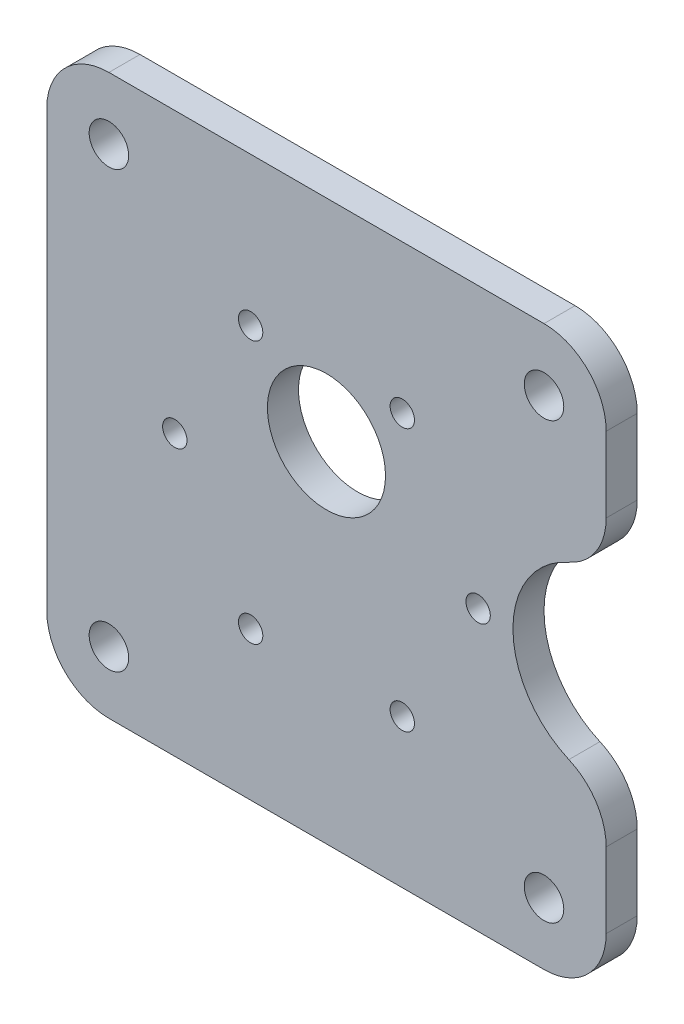
ISO-10303-21;
HEADER;
FILE_DESCRIPTION(('STEP AP214'),'2;1');
FILE_NAME('part.step','',(''),(''),'','','');
FILE_SCHEMA(('AUTOMOTIVE_DESIGN { 1 0 10303 214 1 1 1 1 }'));
ENDSEC;
DATA;
#1=APPLICATION_CONTEXT('core data for automotive mechanical design processes');
#2=APPLICATION_PROTOCOL_DEFINITION('international standard','automotive_design',2000,#1);
#3=PRODUCT_CONTEXT('',#1,'mechanical');
#4=PRODUCT('Part','Part','',(#3));
#5=PRODUCT_RELATED_PRODUCT_CATEGORY('part','',(#4));
#6=PRODUCT_DEFINITION_FORMATION('','',#4);
#7=PRODUCT_DEFINITION_CONTEXT('part definition',#1,'design');
#8=PRODUCT_DEFINITION('design','',#6,#7);
#9=PRODUCT_DEFINITION_SHAPE('','',#8);
#10=(LENGTH_UNIT() NAMED_UNIT(*) SI_UNIT(.MILLI.,.METRE.));
#11=(NAMED_UNIT(*) PLANE_ANGLE_UNIT() SI_UNIT($,.RADIAN.));
#12=(NAMED_UNIT(*) SI_UNIT($,.STERADIAN.) SOLID_ANGLE_UNIT());
#13=UNCERTAINTY_MEASURE_WITH_UNIT(LENGTH_MEASURE(1.E-05),#10,'distance_accuracy_value','');
#14=(GEOMETRIC_REPRESENTATION_CONTEXT(3) GLOBAL_UNCERTAINTY_ASSIGNED_CONTEXT((#13)) GLOBAL_UNIT_ASSIGNED_CONTEXT((#10,
#11,#12)) REPRESENTATION_CONTEXT('',''));
#15=CARTESIAN_POINT('',(0.,0.,0.));
#16=DIRECTION('',(0.,0.,1.));
#17=DIRECTION('',(1.,0.,0.));
#18=AXIS2_PLACEMENT_3D('',#15,#16,#17);
#19=CARTESIAN_POINT('',(28.575,0.,1.5875));
#20=DIRECTION('',(0.,0.,-1.));
#21=DIRECTION('',(-1.,0.,0.));
#22=AXIS2_PLACEMENT_3D('',#19,#20,#21);
#23=CYLINDRICAL_SURFACE('',#22,9.525);
#24=CARTESIAN_POINT('',(28.575,0.,1.5875));
#25=DIRECTION('',(0.,0.,1.));
#26=DIRECTION('',(1.,0.,0.));
#27=AXIS2_PLACEMENT_3D('',#24,#25,#26);
#28=CIRCLE('',#27,9.525);
#29=CARTESIAN_POINT('',(24.765,8.72980669889088,1.5875));
#30=VERTEX_POINT('',#29);
#31=CARTESIAN_POINT('',(24.765,-8.72980669889088,1.5875));
#32=VERTEX_POINT('',#31);
#33=EDGE_CURVE('E339',#30,#32,#28,.T.);
#34=ORIENTED_EDGE('',*,*,#33,.T.);
#35=DIRECTION('',(0.,0.,-1.));
#36=VECTOR('',#35,1.);
#37=CARTESIAN_POINT('',(24.765,-8.72980669889088,1.5875));
#38=LINE('',#37,#36);
#39=CARTESIAN_POINT('',(24.765,-8.72980669889088,-1.5875));
#40=VERTEX_POINT('',#39);
#41=EDGE_CURVE('E150',#32,#40,#38,.T.);
#42=ORIENTED_EDGE('',*,*,#41,.T.);
#43=CARTESIAN_POINT('',(28.575,0.,-1.5875));
#44=DIRECTION('',(0.,0.,1.));
#45=DIRECTION('',(1.,0.,0.));
#46=AXIS2_PLACEMENT_3D('',#43,#44,#45);
#47=CIRCLE('',#46,9.525);
#48=CARTESIAN_POINT('',(24.765,8.72980669889088,-1.5875));
#49=VERTEX_POINT('',#48);
#50=EDGE_CURVE('E134',#49,#40,#47,.T.);
#51=ORIENTED_EDGE('',*,*,#50,.F.);
#52=DIRECTION('',(0.,0.,-1.));
#53=VECTOR('',#52,1.);
#54=CARTESIAN_POINT('',(24.765,8.72980669889088,1.5875));
#55=LINE('',#54,#53);
#56=EDGE_CURVE('E147',#49,#30,#55,.F.);
#57=ORIENTED_EDGE('',*,*,#56,.T.);
#58=EDGE_LOOP('',(#34,#42,#51,#57));
#59=FACE_BOUND('',#58,.T.);
#60=ADVANCED_FACE('F39',(#59),#23,.F.);
#61=CARTESIAN_POINT('',(28.575,0.,1.5875));
#62=DIRECTION('',(1.,0.,0.));
#63=DIRECTION('',(0.,0.,-1.));
#64=AXIS2_PLACEMENT_3D('',#61,#62,#63);
#65=PLANE('',#64);
#66=DIRECTION('',(0.,-1.,0.));
#67=VECTOR('',#66,1.);
#68=CARTESIAN_POINT('',(28.575,0.,1.5875));
#69=LINE('',#68,#67);
#70=CARTESIAN_POINT('',(28.575,22.225,1.5875));
#71=VERTEX_POINT('',#70);
#72=CARTESIAN_POINT('',(28.575,14.5496778314848,1.5875));
#73=VERTEX_POINT('',#72);
#74=EDGE_CURVE('E218',#71,#73,#69,.T.);
#75=ORIENTED_EDGE('',*,*,#74,.T.);
#76=DIRECTION('',(0.,0.,-1.));
#77=VECTOR('',#76,1.);
#78=CARTESIAN_POINT('',(28.575,14.5496778314848,1.5875));
#79=LINE('',#78,#77);
#80=CARTESIAN_POINT('',(28.575,14.5496778314848,-1.5875));
#81=VERTEX_POINT('',#80);
#82=EDGE_CURVE('E189',#73,#81,#79,.T.);
#83=ORIENTED_EDGE('',*,*,#82,.T.);
#84=DIRECTION('',(0.,-1.,0.));
#85=VECTOR('',#84,1.);
#86=CARTESIAN_POINT('',(28.575,0.,-1.5875));
#87=LINE('',#86,#85);
#88=CARTESIAN_POINT('',(28.575,22.225,-1.5875));
#89=VERTEX_POINT('',#88);
#90=EDGE_CURVE('E136',#89,#81,#87,.T.);
#91=ORIENTED_EDGE('',*,*,#90,.F.);
#92=DIRECTION('',(0.,0.,-1.));
#93=VECTOR('',#92,1.);
#94=CARTESIAN_POINT('',(28.575,22.225,1.5875));
#95=LINE('',#94,#93);
#96=EDGE_CURVE('E187',#89,#71,#95,.F.);
#97=ORIENTED_EDGE('',*,*,#96,.T.);
#98=EDGE_LOOP('',(#75,#83,#91,#97));
#99=FACE_BOUND('',#98,.T.);
#100=ADVANCED_FACE('F376',(#99),#65,.T.);
#101=CARTESIAN_POINT('',(0.,28.575,1.5875));
#102=DIRECTION('',(0.,1.,0.));
#103=DIRECTION('',(0.,0.,1.));
#104=AXIS2_PLACEMENT_3D('',#101,#102,#103);
#105=PLANE('',#104);
#106=DIRECTION('',(1.,0.,0.));
#107=VECTOR('',#106,1.);
#108=CARTESIAN_POINT('',(0.,28.575,1.5875));
#109=LINE('',#108,#107);
#110=CARTESIAN_POINT('',(-22.225,28.575,1.5875));
#111=VERTEX_POINT('',#110);
#112=CARTESIAN_POINT('',(22.225,28.575,1.5875));
#113=VERTEX_POINT('',#112);
#114=EDGE_CURVE('E205',#111,#113,#109,.T.);
#115=ORIENTED_EDGE('',*,*,#114,.T.);
#116=DIRECTION('',(0.,0.,-1.));
#117=VECTOR('',#116,1.);
#118=CARTESIAN_POINT('',(22.225,28.575,1.5875));
#119=LINE('',#118,#117);
#120=CARTESIAN_POINT('',(22.225,28.575,-1.5875));
#121=VERTEX_POINT('',#120);
#122=EDGE_CURVE('E12',#113,#121,#119,.T.);
#123=ORIENTED_EDGE('',*,*,#122,.T.);
#124=DIRECTION('',(1.,0.,0.));
#125=VECTOR('',#124,1.);
#126=CARTESIAN_POINT('',(0.,28.575,-1.5875));
#127=LINE('',#126,#125);
#128=CARTESIAN_POINT('',(-22.225,28.575,-1.5875));
#129=VERTEX_POINT('',#128);
#130=EDGE_CURVE('E208',#129,#121,#127,.T.);
#131=ORIENTED_EDGE('',*,*,#130,.F.);
#132=DIRECTION('',(0.,0.,-1.));
#133=VECTOR('',#132,1.);
#134=CARTESIAN_POINT('',(-22.225,28.575,1.5875));
#135=LINE('',#134,#133);
#136=EDGE_CURVE('E47',#129,#111,#135,.F.);
#137=ORIENTED_EDGE('',*,*,#136,.T.);
#138=EDGE_LOOP('',(#115,#123,#131,#137));
#139=FACE_BOUND('',#138,.T.);
#140=ADVANCED_FACE('F204',(#139),#105,.T.);
#141=CARTESIAN_POINT('',(-28.575,0.,1.5875));
#142=DIRECTION('',(1.,0.,0.));
#143=DIRECTION('',(0.,0.,-1.));
#144=AXIS2_PLACEMENT_3D('',#141,#142,#143);
#145=PLANE('',#144);
#146=DIRECTION('',(0.,-1.,0.));
#147=VECTOR('',#146,1.);
#148=CARTESIAN_POINT('',(-28.575,0.,-1.5875));
#149=LINE('',#148,#147);
#150=CARTESIAN_POINT('',(-28.575,22.225,-1.5875));
#151=VERTEX_POINT('',#150);
#152=CARTESIAN_POINT('',(-28.575,-22.225,-1.5875));
#153=VERTEX_POINT('',#152);
#154=EDGE_CURVE('E225',#151,#153,#149,.T.);
#155=ORIENTED_EDGE('',*,*,#154,.T.);
#156=DIRECTION('',(0.,0.,-1.));
#157=VECTOR('',#156,1.);
#158=CARTESIAN_POINT('',(-28.575,-22.225,1.5875));
#159=LINE('',#158,#157);
#160=CARTESIAN_POINT('',(-28.575,-22.225,1.5875));
#161=VERTEX_POINT('',#160);
#162=EDGE_CURVE('E198',#153,#161,#159,.F.);
#163=ORIENTED_EDGE('',*,*,#162,.T.);
#164=DIRECTION('',(0.,-1.,0.));
#165=VECTOR('',#164,1.);
#166=CARTESIAN_POINT('',(-28.575,0.,1.5875));
#167=LINE('',#166,#165);
#168=CARTESIAN_POINT('',(-28.575,22.225,1.5875));
#169=VERTEX_POINT('',#168);
#170=EDGE_CURVE('E217',#169,#161,#167,.T.);
#171=ORIENTED_EDGE('',*,*,#170,.F.);
#172=DIRECTION('',(0.,0.,-1.));
#173=VECTOR('',#172,1.);
#174=CARTESIAN_POINT('',(-28.575,22.225,-1.5875));
#175=LINE('',#174,#173);
#176=EDGE_CURVE('E195',#169,#151,#175,.T.);
#177=ORIENTED_EDGE('',*,*,#176,.T.);
#178=EDGE_LOOP('',(#155,#163,#171,#177));
#179=FACE_BOUND('',#178,.T.);
#180=ADVANCED_FACE('F224',(#179),#145,.F.);
#181=CARTESIAN_POINT('',(0.,-28.575,1.5875));
#182=DIRECTION('',(0.,1.,0.));
#183=DIRECTION('',(0.,0.,1.));
#184=AXIS2_PLACEMENT_3D('',#181,#182,#183);
#185=PLANE('',#184);
#186=DIRECTION('',(1.,0.,0.));
#187=VECTOR('',#186,1.);
#188=CARTESIAN_POINT('',(0.,-28.575,1.5875));
#189=LINE('',#188,#187);
#190=CARTESIAN_POINT('',(-22.225,-28.575,1.5875));
#191=VERTEX_POINT('',#190);
#192=CARTESIAN_POINT('',(22.225,-28.575,1.5875));
#193=VERTEX_POINT('',#192);
#194=EDGE_CURVE('E299',#191,#193,#189,.T.);
#195=ORIENTED_EDGE('',*,*,#194,.F.);
#196=DIRECTION('',(0.,0.,-1.));
#197=VECTOR('',#196,1.);
#198=CARTESIAN_POINT('',(-22.225,-28.575,1.5875));
#199=LINE('',#198,#197);
#200=CARTESIAN_POINT('',(-22.225,-28.575,-1.5875));
#201=VERTEX_POINT('',#200);
#202=EDGE_CURVE('E192',#191,#201,#199,.T.);
#203=ORIENTED_EDGE('',*,*,#202,.T.);
#204=DIRECTION('',(1.,0.,0.));
#205=VECTOR('',#204,1.);
#206=CARTESIAN_POINT('',(0.,-28.575,-1.5875));
#207=LINE('',#206,#205);
#208=CARTESIAN_POINT('',(22.225,-28.575,-1.5875));
#209=VERTEX_POINT('',#208);
#210=EDGE_CURVE('E228',#201,#209,#207,.T.);
#211=ORIENTED_EDGE('',*,*,#210,.T.);
#212=DIRECTION('',(0.,0.,-1.));
#213=VECTOR('',#212,1.);
#214=CARTESIAN_POINT('',(22.225,-28.575,1.5875));
#215=LINE('',#214,#213);
#216=EDGE_CURVE('E54',#209,#193,#215,.F.);
#217=ORIENTED_EDGE('',*,*,#216,.T.);
#218=EDGE_LOOP('',(#195,#203,#211,#217));
#219=FACE_BOUND('',#218,.T.);
#220=ADVANCED_FACE('F417',(#219),#185,.F.);
#221=CARTESIAN_POINT('',(-7.74699999999996,13.4181976062361,1.5875));
#222=DIRECTION('',(0.,0.,-1.));
#223=DIRECTION('',(-1.,0.,0.));
#224=AXIS2_PLACEMENT_3D('',#221,#222,#223);
#225=CYLINDRICAL_SURFACE('',#224,1.2446);
#226=CARTESIAN_POINT('',(-7.74699999999996,13.4181976062361,1.5875));
#227=DIRECTION('',(0.,0.,1.));
#228=DIRECTION('',(1.,0.,0.));
#229=AXIS2_PLACEMENT_3D('',#226,#227,#228);
#230=CIRCLE('',#229,1.2446);
#231=CARTESIAN_POINT('',(-6.50239999999996,13.4181976062361,1.5875));
#232=VERTEX_POINT('',#231);
#233=EDGE_CURVE('E160',#232,#232,#230,.T.);
#234=ORIENTED_EDGE('',*,*,#233,.T.);
#235=EDGE_LOOP('',(#234));
#236=FACE_BOUND('',#235,.T.);
#237=CARTESIAN_POINT('',(-7.74699999999996,13.4181976062361,-1.5875));
#238=DIRECTION('',(0.,0.,1.));
#239=DIRECTION('',(1.,0.,0.));
#240=AXIS2_PLACEMENT_3D('',#237,#238,#239);
#241=CIRCLE('',#240,1.2446);
#242=CARTESIAN_POINT('',(-6.50239999999996,13.4181976062361,-1.5875));
#243=VERTEX_POINT('',#242);
#244=EDGE_CURVE('E340',#243,#243,#241,.T.);
#245=ORIENTED_EDGE('',*,*,#244,.F.);
#246=EDGE_LOOP('',(#245));
#247=FACE_BOUND('',#246,.T.);
#248=ADVANCED_FACE('F419',(#236,#247),#225,.F.);
#249=CARTESIAN_POINT('',(7.74700000000007,13.4181976062361,1.5875));
#250=DIRECTION('',(0.,0.,-1.));
#251=DIRECTION('',(-1.,0.,0.));
#252=AXIS2_PLACEMENT_3D('',#249,#250,#251);
#253=CYLINDRICAL_SURFACE('',#252,1.2446);
#254=CARTESIAN_POINT('',(7.74700000000007,13.4181976062361,1.5875));
#255=DIRECTION('',(0.,0.,1.));
#256=DIRECTION('',(1.,0.,0.));
#257=AXIS2_PLACEMENT_3D('',#254,#255,#256);
#258=CIRCLE('',#257,1.2446);
#259=CARTESIAN_POINT('',(8.99160000000007,13.4181976062361,1.5875));
#260=VERTEX_POINT('',#259);
#261=EDGE_CURVE('E284',#260,#260,#258,.T.);
#262=ORIENTED_EDGE('',*,*,#261,.T.);
#263=EDGE_LOOP('',(#262));
#264=FACE_BOUND('',#263,.T.);
#265=CARTESIAN_POINT('',(7.74700000000007,13.4181976062361,-1.5875));
#266=DIRECTION('',(0.,0.,1.));
#267=DIRECTION('',(1.,0.,0.));
#268=AXIS2_PLACEMENT_3D('',#265,#266,#267);
#269=CIRCLE('',#268,1.2446);
#270=CARTESIAN_POINT('',(8.99160000000007,13.4181976062361,-1.5875));
#271=VERTEX_POINT('',#270);
#272=EDGE_CURVE('E343',#271,#271,#269,.T.);
#273=ORIENTED_EDGE('',*,*,#272,.F.);
#274=EDGE_LOOP('',(#273));
#275=FACE_BOUND('',#274,.T.);
#276=ADVANCED_FACE('F425',(#264,#275),#253,.F.);
#277=CARTESIAN_POINT('',(15.494,-1.23599047663348E-13,1.5875));
#278=DIRECTION('',(0.,0.,-1.));
#279=DIRECTION('',(-1.,0.,0.));
#280=AXIS2_PLACEMENT_3D('',#277,#278,#279);
#281=CYLINDRICAL_SURFACE('',#280,1.2446);
#282=CARTESIAN_POINT('',(15.494,-1.23599047663348E-13,1.5875));
#283=DIRECTION('',(0.,0.,1.));
#284=DIRECTION('',(1.,0.,0.));
#285=AXIS2_PLACEMENT_3D('',#282,#283,#284);
#286=CIRCLE('',#285,1.2446);
#287=CARTESIAN_POINT('',(16.7386,-1.23599047663348E-13,1.5875));
#288=VERTEX_POINT('',#287);
#289=EDGE_CURVE('E281',#288,#288,#286,.T.);
#290=ORIENTED_EDGE('',*,*,#289,.T.);
#291=EDGE_LOOP('',(#290));
#292=FACE_BOUND('',#291,.T.);
#293=CARTESIAN_POINT('',(15.494,-1.23599047663348E-13,-1.5875));
#294=DIRECTION('',(0.,0.,1.));
#295=DIRECTION('',(1.,0.,0.));
#296=AXIS2_PLACEMENT_3D('',#293,#294,#295);
#297=CIRCLE('',#296,1.2446);
#298=CARTESIAN_POINT('',(16.7386,-1.23599047663348E-13,-1.5875));
#299=VERTEX_POINT('',#298);
#300=EDGE_CURVE('E347',#299,#299,#297,.T.);
#301=ORIENTED_EDGE('',*,*,#300,.F.);
#302=EDGE_LOOP('',(#301));
#303=FACE_BOUND('',#302,.T.);
#304=ADVANCED_FACE('F372',(#292,#303),#281,.F.);
#305=CARTESIAN_POINT('',(7.74699999999986,-13.4181976062362,1.5875));
#306=DIRECTION('',(0.,0.,-1.));
#307=DIRECTION('',(-1.,0.,0.));
#308=AXIS2_PLACEMENT_3D('',#305,#306,#307);
#309=CYLINDRICAL_SURFACE('',#308,1.2446);
#310=CARTESIAN_POINT('',(7.74699999999986,-13.4181976062362,1.5875));
#311=DIRECTION('',(0.,0.,1.));
#312=DIRECTION('',(1.,0.,0.));
#313=AXIS2_PLACEMENT_3D('',#310,#311,#312);
#314=CIRCLE('',#313,1.2446);
#315=CARTESIAN_POINT('',(8.99159999999986,-13.4181976062362,1.5875));
#316=VERTEX_POINT('',#315);
#317=EDGE_CURVE('E273',#316,#316,#314,.T.);
#318=ORIENTED_EDGE('',*,*,#317,.T.);
#319=EDGE_LOOP('',(#318));
#320=FACE_BOUND('',#319,.T.);
#321=CARTESIAN_POINT('',(7.74699999999986,-13.4181976062362,-1.5875));
#322=DIRECTION('',(0.,0.,1.));
#323=DIRECTION('',(1.,0.,0.));
#324=AXIS2_PLACEMENT_3D('',#321,#322,#323);
#325=CIRCLE('',#324,1.2446);
#326=CARTESIAN_POINT('',(8.99159999999986,-13.4181976062362,-1.5875));
#327=VERTEX_POINT('',#326);
#328=EDGE_CURVE('E351',#327,#327,#325,.T.);
#329=ORIENTED_EDGE('',*,*,#328,.F.);
#330=EDGE_LOOP('',(#329));
#331=FACE_BOUND('',#330,.T.);
#332=ADVANCED_FACE('F362',(#320,#331),#309,.F.);
#333=CARTESIAN_POINT('',(-7.74700000000017,-13.418197606236,1.5875));
#334=DIRECTION('',(0.,0.,-1.));
#335=DIRECTION('',(-1.,0.,0.));
#336=AXIS2_PLACEMENT_3D('',#333,#334,#335);
#337=CYLINDRICAL_SURFACE('',#336,1.2446);
#338=CARTESIAN_POINT('',(-7.74700000000017,-13.418197606236,1.5875));
#339=DIRECTION('',(0.,0.,1.));
#340=DIRECTION('',(1.,0.,0.));
#341=AXIS2_PLACEMENT_3D('',#338,#339,#340);
#342=CIRCLE('',#341,1.2446);
#343=CARTESIAN_POINT('',(-6.50240000000017,-13.418197606236,1.5875));
#344=VERTEX_POINT('',#343);
#345=EDGE_CURVE('E269',#344,#344,#342,.T.);
#346=ORIENTED_EDGE('',*,*,#345,.T.);
#347=EDGE_LOOP('',(#346));
#348=FACE_BOUND('',#347,.T.);
#349=CARTESIAN_POINT('',(-7.74700000000017,-13.418197606236,-1.5875));
#350=DIRECTION('',(0.,0.,1.));
#351=DIRECTION('',(1.,0.,0.));
#352=AXIS2_PLACEMENT_3D('',#349,#350,#351);
#353=CIRCLE('',#352,1.2446);
#354=CARTESIAN_POINT('',(-6.50240000000017,-13.418197606236,-1.5875));
#355=VERTEX_POINT('',#354);
#356=EDGE_CURVE('E251',#355,#355,#353,.T.);
#357=ORIENTED_EDGE('',*,*,#356,.F.);
#358=EDGE_LOOP('',(#357));
#359=FACE_BOUND('',#358,.T.);
#360=ADVANCED_FACE('F359',(#348,#359),#337,.F.);
#361=CARTESIAN_POINT('',(0.,7.0104,1.5875));
#362=DIRECTION('',(0.,0.,-1.));
#363=DIRECTION('',(-1.,0.,0.));
#364=AXIS2_PLACEMENT_3D('',#361,#362,#363);
#365=CYLINDRICAL_SURFACE('',#364,6.0325);
#366=CARTESIAN_POINT('',(0.,7.0104,1.5875));
#367=DIRECTION('',(0.,0.,1.));
#368=DIRECTION('',(1.,0.,0.));
#369=AXIS2_PLACEMENT_3D('',#366,#367,#368);
#370=CIRCLE('',#369,6.0325);
#371=CARTESIAN_POINT('',(6.0325,7.0104,1.5875));
#372=VERTEX_POINT('',#371);
#373=EDGE_CURVE('E264',#372,#372,#370,.T.);
#374=ORIENTED_EDGE('',*,*,#373,.T.);
#375=EDGE_LOOP('',(#374));
#376=FACE_BOUND('',#375,.T.);
#377=CARTESIAN_POINT('',(0.,7.0104,-1.5875));
#378=DIRECTION('',(0.,0.,1.));
#379=DIRECTION('',(1.,0.,0.));
#380=AXIS2_PLACEMENT_3D('',#377,#378,#379);
#381=CIRCLE('',#380,6.0325);
#382=CARTESIAN_POINT('',(6.0325,7.0104,-1.5875));
#383=VERTEX_POINT('',#382);
#384=EDGE_CURVE('E247',#383,#383,#381,.T.);
#385=ORIENTED_EDGE('',*,*,#384,.F.);
#386=EDGE_LOOP('',(#385));
#387=FACE_BOUND('',#386,.T.);
#388=ADVANCED_FACE('F361',(#376,#387),#365,.F.);
#389=CARTESIAN_POINT('',(-22.225,22.225,1.5875));
#390=DIRECTION('',(0.,0.,-1.));
#391=DIRECTION('',(-1.,0.,0.));
#392=AXIS2_PLACEMENT_3D('',#389,#390,#391);
#393=CYLINDRICAL_SURFACE('',#392,2.0193);
#394=CARTESIAN_POINT('',(-22.225,22.225,1.5875));
#395=DIRECTION('',(0.,0.,1.));
#396=DIRECTION('',(1.,0.,0.));
#397=AXIS2_PLACEMENT_3D('',#394,#395,#396);
#398=CIRCLE('',#397,2.0193);
#399=CARTESIAN_POINT('',(-20.2057,22.225,1.5875));
#400=VERTEX_POINT('',#399);
#401=EDGE_CURVE('E259',#400,#400,#398,.T.);
#402=ORIENTED_EDGE('',*,*,#401,.T.);
#403=EDGE_LOOP('',(#402));
#404=FACE_BOUND('',#403,.T.);
#405=CARTESIAN_POINT('',(-22.225,22.225,-1.5875));
#406=DIRECTION('',(0.,0.,1.));
#407=DIRECTION('',(1.,0.,0.));
#408=AXIS2_PLACEMENT_3D('',#405,#406,#407);
#409=CIRCLE('',#408,2.0193);
#410=CARTESIAN_POINT('',(-20.2057,22.225,-1.5875));
#411=VERTEX_POINT('',#410);
#412=EDGE_CURVE('E244',#411,#411,#409,.T.);
#413=ORIENTED_EDGE('',*,*,#412,.F.);
#414=EDGE_LOOP('',(#413));
#415=FACE_BOUND('',#414,.T.);
#416=ADVANCED_FACE('F369',(#404,#415),#393,.F.);
#417=CARTESIAN_POINT('',(22.225,22.225,1.5875));
#418=DIRECTION('',(0.,0.,-1.));
#419=DIRECTION('',(-1.,0.,0.));
#420=AXIS2_PLACEMENT_3D('',#417,#418,#419);
#421=CYLINDRICAL_SURFACE('',#420,2.0193);
#422=CARTESIAN_POINT('',(22.225,22.225,1.5875));
#423=DIRECTION('',(0.,0.,1.));
#424=DIRECTION('',(1.,0.,0.));
#425=AXIS2_PLACEMENT_3D('',#422,#423,#424);
#426=CIRCLE('',#425,2.0193);
#427=CARTESIAN_POINT('',(24.2443,22.225,1.5875));
#428=VERTEX_POINT('',#427);
#429=EDGE_CURVE('E265',#428,#428,#426,.T.);
#430=ORIENTED_EDGE('',*,*,#429,.T.);
#431=EDGE_LOOP('',(#430));
#432=FACE_BOUND('',#431,.T.);
#433=CARTESIAN_POINT('',(22.225,22.225,-1.5875));
#434=DIRECTION('',(0.,0.,1.));
#435=DIRECTION('',(1.,0.,0.));
#436=AXIS2_PLACEMENT_3D('',#433,#434,#435);
#437=CIRCLE('',#436,2.0193);
#438=CARTESIAN_POINT('',(24.2443,22.225,-1.5875));
#439=VERTEX_POINT('',#438);
#440=EDGE_CURVE('E241',#439,#439,#437,.T.);
#441=ORIENTED_EDGE('',*,*,#440,.F.);
#442=EDGE_LOOP('',(#441));
#443=FACE_BOUND('',#442,.T.);
#444=ADVANCED_FACE('F308',(#432,#443),#421,.F.);
#445=CARTESIAN_POINT('',(-22.225,-22.225,1.5875));
#446=DIRECTION('',(0.,0.,-1.));
#447=DIRECTION('',(-1.,0.,0.));
#448=AXIS2_PLACEMENT_3D('',#445,#446,#447);
#449=CYLINDRICAL_SURFACE('',#448,2.0193);
#450=CARTESIAN_POINT('',(-22.225,-22.225,1.5875));
#451=DIRECTION('',(0.,0.,1.));
#452=DIRECTION('',(1.,0.,0.));
#453=AXIS2_PLACEMENT_3D('',#450,#451,#452);
#454=CIRCLE('',#453,2.0193);
#455=CARTESIAN_POINT('',(-20.2057,-22.225,1.5875));
#456=VERTEX_POINT('',#455);
#457=EDGE_CURVE('E297',#456,#456,#454,.T.);
#458=ORIENTED_EDGE('',*,*,#457,.T.);
#459=EDGE_LOOP('',(#458));
#460=FACE_BOUND('',#459,.T.);
#461=CARTESIAN_POINT('',(-22.225,-22.225,-1.5875));
#462=DIRECTION('',(0.,0.,1.));
#463=DIRECTION('',(1.,0.,0.));
#464=AXIS2_PLACEMENT_3D('',#461,#462,#463);
#465=CIRCLE('',#464,2.0193);
#466=CARTESIAN_POINT('',(-20.2057,-22.225,-1.5875));
#467=VERTEX_POINT('',#466);
#468=EDGE_CURVE('E238',#467,#467,#465,.T.);
#469=ORIENTED_EDGE('',*,*,#468,.F.);
#470=EDGE_LOOP('',(#469));
#471=FACE_BOUND('',#470,.T.);
#472=ADVANCED_FACE('F433',(#460,#471),#449,.F.);
#473=CARTESIAN_POINT('',(22.225,-22.225,1.5875));
#474=DIRECTION('',(0.,0.,-1.));
#475=DIRECTION('',(-1.,0.,0.));
#476=AXIS2_PLACEMENT_3D('',#473,#474,#475);
#477=CYLINDRICAL_SURFACE('',#476,2.0193);
#478=CARTESIAN_POINT('',(22.225,-22.225,1.5875));
#479=DIRECTION('',(0.,0.,1.));
#480=DIRECTION('',(1.,0.,0.));
#481=AXIS2_PLACEMENT_3D('',#478,#479,#480);
#482=CIRCLE('',#481,2.0193);
#483=CARTESIAN_POINT('',(24.2443,-22.225,1.5875));
#484=VERTEX_POINT('',#483);
#485=EDGE_CURVE('E293',#484,#484,#482,.T.);
#486=ORIENTED_EDGE('',*,*,#485,.T.);
#487=EDGE_LOOP('',(#486));
#488=FACE_BOUND('',#487,.T.);
#489=CARTESIAN_POINT('',(22.225,-22.225,-1.5875));
#490=DIRECTION('',(0.,0.,1.));
#491=DIRECTION('',(1.,0.,0.));
#492=AXIS2_PLACEMENT_3D('',#489,#490,#491);
#493=CIRCLE('',#492,2.0193);
#494=CARTESIAN_POINT('',(24.2443,-22.225,-1.5875));
#495=VERTEX_POINT('',#494);
#496=EDGE_CURVE('E235',#495,#495,#493,.T.);
#497=ORIENTED_EDGE('',*,*,#496,.F.);
#498=EDGE_LOOP('',(#497));
#499=FACE_BOUND('',#498,.T.);
#500=ADVANCED_FACE('F430',(#488,#499),#477,.F.);
#501=CARTESIAN_POINT('',(28.575,-14.5496778314848,-1.5875));
#502=VERTEX_POINT('',#501);
#503=CARTESIAN_POINT('',(28.575,-22.225,-1.5875));
#504=VERTEX_POINT('',#503);
#505=EDGE_CURVE('E230',#502,#504,#87,.T.);
#506=ORIENTED_EDGE('',*,*,#505,.F.);
#507=DIRECTION('',(0.,0.,-1.));
#508=VECTOR('',#507,1.);
#509=CARTESIAN_POINT('',(28.575,-14.5496778314848,1.5875));
#510=LINE('',#509,#508);
#511=CARTESIAN_POINT('',(28.575,-14.5496778314848,1.5875));
#512=VERTEX_POINT('',#511);
#513=EDGE_CURVE('E175',#502,#512,#510,.F.);
#514=ORIENTED_EDGE('',*,*,#513,.T.);
#515=CARTESIAN_POINT('',(28.575,-22.225,1.5875));
#516=VERTEX_POINT('',#515);
#517=EDGE_CURVE('E298',#512,#516,#69,.T.);
#518=ORIENTED_EDGE('',*,*,#517,.T.);
#519=DIRECTION('',(0.,0.,-1.));
#520=VECTOR('',#519,1.);
#521=CARTESIAN_POINT('',(28.575,-22.225,-1.5875));
#522=LINE('',#521,#520);
#523=EDGE_CURVE('E172',#516,#504,#522,.T.);
#524=ORIENTED_EDGE('',*,*,#523,.T.);
#525=EDGE_LOOP('',(#506,#514,#518,#524));
#526=FACE_BOUND('',#525,.T.);
#527=ADVANCED_FACE('F334',(#526),#65,.T.);
#528=CARTESIAN_POINT('',(-15.494,0.,1.5875));
#529=DIRECTION('',(0.,0.,-1.));
#530=DIRECTION('',(-1.,0.,0.));
#531=AXIS2_PLACEMENT_3D('',#528,#529,#530);
#532=CYLINDRICAL_SURFACE('',#531,1.2446);
#533=CARTESIAN_POINT('',(-15.494,0.,1.5875));
#534=DIRECTION('',(0.,0.,1.));
#535=DIRECTION('',(1.,0.,0.));
#536=AXIS2_PLACEMENT_3D('',#533,#534,#535);
#537=CIRCLE('',#536,1.2446);
#538=CARTESIAN_POINT('',(-14.2494,0.,1.5875));
#539=VERTEX_POINT('',#538);
#540=EDGE_CURVE('E155',#539,#539,#537,.T.);
#541=ORIENTED_EDGE('',*,*,#540,.T.);
#542=EDGE_LOOP('',(#541));
#543=FACE_BOUND('',#542,.T.);
#544=CARTESIAN_POINT('',(-15.494,0.,-1.5875));
#545=DIRECTION('',(0.,0.,1.));
#546=DIRECTION('',(1.,0.,0.));
#547=AXIS2_PLACEMENT_3D('',#544,#545,#546);
#548=CIRCLE('',#547,1.2446);
#549=CARTESIAN_POINT('',(-14.2494,0.,-1.5875));
#550=VERTEX_POINT('',#549);
#551=EDGE_CURVE('E162',#550,#550,#548,.T.);
#552=ORIENTED_EDGE('',*,*,#551,.F.);
#553=EDGE_LOOP('',(#552));
#554=FACE_BOUND('',#553,.T.);
#555=ADVANCED_FACE('F313',(#543,#554),#532,.F.);
#556=CARTESIAN_POINT('',(0.,0.,1.5875));
#557=DIRECTION('',(0.,0.,1.));
#558=DIRECTION('',(1.,0.,0.));
#559=AXIS2_PLACEMENT_3D('',#556,#557,#558);
#560=PLANE('',#559);
#561=ORIENTED_EDGE('',*,*,#517,.F.);
#562=CARTESIAN_POINT('',(22.225,-14.5496778314848,1.5875));
#563=DIRECTION('',(0.,0.,1.));
#564=DIRECTION('',(1.,0.,0.));
#565=AXIS2_PLACEMENT_3D('',#562,#563,#564);
#566=CIRCLE('',#565,6.35);
#567=EDGE_CURVE('E185',#512,#32,#566,.T.);
#568=ORIENTED_EDGE('',*,*,#567,.T.);
#569=ORIENTED_EDGE('',*,*,#33,.F.);
#570=CARTESIAN_POINT('',(22.225,14.5496778314848,1.5875));
#571=DIRECTION('',(0.,0.,1.));
#572=DIRECTION('',(1.,0.,0.));
#573=AXIS2_PLACEMENT_3D('',#570,#571,#572);
#574=CIRCLE('',#573,6.35);
#575=EDGE_CURVE('E154',#30,#73,#574,.T.);
#576=ORIENTED_EDGE('',*,*,#575,.T.);
#577=ORIENTED_EDGE('',*,*,#74,.F.);
#578=CARTESIAN_POINT('',(22.225,22.225,1.5875));
#579=DIRECTION('',(0.,0.,1.));
#580=DIRECTION('',(1.,0.,0.));
#581=AXIS2_PLACEMENT_3D('',#578,#579,#580);
#582=CIRCLE('',#581,6.35);
#583=EDGE_CURVE('E179',#71,#113,#582,.T.);
#584=ORIENTED_EDGE('',*,*,#583,.T.);
#585=ORIENTED_EDGE('',*,*,#114,.F.);
#586=CARTESIAN_POINT('',(-22.225,22.225,1.5875));
#587=DIRECTION('',(0.,0.,1.));
#588=DIRECTION('',(1.,0.,0.));
#589=AXIS2_PLACEMENT_3D('',#586,#587,#588);
#590=CIRCLE('',#589,6.35);
#591=EDGE_CURVE('E177',#111,#169,#590,.T.);
#592=ORIENTED_EDGE('',*,*,#591,.T.);
#593=ORIENTED_EDGE('',*,*,#170,.T.);
#594=CARTESIAN_POINT('',(-22.225,-22.225,1.5875));
#595=DIRECTION('',(0.,0.,1.));
#596=DIRECTION('',(1.,0.,0.));
#597=AXIS2_PLACEMENT_3D('',#594,#595,#596);
#598=CIRCLE('',#597,6.35);
#599=EDGE_CURVE('E61',#161,#191,#598,.T.);
#600=ORIENTED_EDGE('',*,*,#599,.T.);
#601=ORIENTED_EDGE('',*,*,#194,.T.);
#602=CARTESIAN_POINT('',(22.225,-22.225,1.5875));
#603=DIRECTION('',(0.,0.,1.));
#604=DIRECTION('',(1.,0.,0.));
#605=AXIS2_PLACEMENT_3D('',#602,#603,#604);
#606=CIRCLE('',#605,6.35);
#607=EDGE_CURVE('E181',#193,#516,#606,.T.);
#608=ORIENTED_EDGE('',*,*,#607,.T.);
#609=EDGE_LOOP('',(#561,#568,#569,#576,#577,#584,#585,#592,#593,#600,#601,#608));
#610=FACE_BOUND('',#609,.T.);
#611=ORIENTED_EDGE('',*,*,#485,.F.);
#612=EDGE_LOOP('',(#611));
#613=FACE_BOUND('',#612,.T.);
#614=ORIENTED_EDGE('',*,*,#457,.F.);
#615=EDGE_LOOP('',(#614));
#616=FACE_BOUND('',#615,.T.);
#617=ORIENTED_EDGE('',*,*,#429,.F.);
#618=EDGE_LOOP('',(#617));
#619=FACE_BOUND('',#618,.T.);
#620=ORIENTED_EDGE('',*,*,#401,.F.);
#621=EDGE_LOOP('',(#620));
#622=FACE_BOUND('',#621,.T.);
#623=ORIENTED_EDGE('',*,*,#373,.F.);
#624=EDGE_LOOP('',(#623));
#625=FACE_BOUND('',#624,.T.);
#626=ORIENTED_EDGE('',*,*,#345,.F.);
#627=EDGE_LOOP('',(#626));
#628=FACE_BOUND('',#627,.T.);
#629=ORIENTED_EDGE('',*,*,#317,.F.);
#630=EDGE_LOOP('',(#629));
#631=FACE_BOUND('',#630,.T.);
#632=ORIENTED_EDGE('',*,*,#289,.F.);
#633=EDGE_LOOP('',(#632));
#634=FACE_BOUND('',#633,.T.);
#635=ORIENTED_EDGE('',*,*,#261,.F.);
#636=EDGE_LOOP('',(#635));
#637=FACE_BOUND('',#636,.T.);
#638=ORIENTED_EDGE('',*,*,#233,.F.);
#639=EDGE_LOOP('',(#638));
#640=FACE_BOUND('',#639,.T.);
#641=ORIENTED_EDGE('',*,*,#540,.F.);
#642=EDGE_LOOP('',(#641));
#643=FACE_BOUND('',#642,.T.);
#644=ADVANCED_FACE('F212',(#610,#613,#616,#619,#622,#625,#628,#631,#634,#637,#640,#643),#560,.T.);
#645=CARTESIAN_POINT('',(0.,0.,-1.5875));
#646=DIRECTION('',(0.,0.,1.));
#647=DIRECTION('',(1.,0.,0.));
#648=AXIS2_PLACEMENT_3D('',#645,#646,#647);
#649=PLANE('',#648);
#650=ORIENTED_EDGE('',*,*,#50,.T.);
#651=CARTESIAN_POINT('',(22.225,-14.5496778314848,-1.5875));
#652=DIRECTION('',(0.,0.,1.));
#653=DIRECTION('',(1.,0.,0.));
#654=AXIS2_PLACEMENT_3D('',#651,#652,#653);
#655=CIRCLE('',#654,6.35);
#656=EDGE_CURVE('E141',#40,#502,#655,.F.);
#657=ORIENTED_EDGE('',*,*,#656,.T.);
#658=ORIENTED_EDGE('',*,*,#505,.T.);
#659=CARTESIAN_POINT('',(22.225,-22.225,-1.5875));
#660=DIRECTION('',(0.,0.,1.));
#661=DIRECTION('',(1.,0.,0.));
#662=AXIS2_PLACEMENT_3D('',#659,#660,#661);
#663=CIRCLE('',#662,6.35);
#664=EDGE_CURVE('E168',#504,#209,#663,.F.);
#665=ORIENTED_EDGE('',*,*,#664,.T.);
#666=ORIENTED_EDGE('',*,*,#210,.F.);
#667=CARTESIAN_POINT('',(-22.225,-22.225,-1.5875));
#668=DIRECTION('',(0.,0.,1.));
#669=DIRECTION('',(1.,0.,0.));
#670=AXIS2_PLACEMENT_3D('',#667,#668,#669);
#671=CIRCLE('',#670,6.35);
#672=EDGE_CURVE('E142',#201,#153,#671,.F.);
#673=ORIENTED_EDGE('',*,*,#672,.T.);
#674=ORIENTED_EDGE('',*,*,#154,.F.);
#675=CARTESIAN_POINT('',(-22.225,22.225,-1.5875));
#676=DIRECTION('',(0.,0.,1.));
#677=DIRECTION('',(1.,0.,0.));
#678=AXIS2_PLACEMENT_3D('',#675,#676,#677);
#679=CIRCLE('',#678,6.35);
#680=EDGE_CURVE('E157',#151,#129,#679,.F.);
#681=ORIENTED_EDGE('',*,*,#680,.T.);
#682=ORIENTED_EDGE('',*,*,#130,.T.);
#683=CARTESIAN_POINT('',(22.225,22.225,-1.5875));
#684=DIRECTION('',(0.,0.,1.));
#685=DIRECTION('',(1.,0.,0.));
#686=AXIS2_PLACEMENT_3D('',#683,#684,#685);
#687=CIRCLE('',#686,6.35);
#688=EDGE_CURVE('E166',#121,#89,#687,.F.);
#689=ORIENTED_EDGE('',*,*,#688,.T.);
#690=ORIENTED_EDGE('',*,*,#90,.T.);
#691=CARTESIAN_POINT('',(22.225,14.5496778314848,-1.5875));
#692=DIRECTION('',(0.,0.,1.));
#693=DIRECTION('',(1.,0.,0.));
#694=AXIS2_PLACEMENT_3D('',#691,#692,#693);
#695=CIRCLE('',#694,6.35);
#696=EDGE_CURVE('E130',#81,#49,#695,.F.);
#697=ORIENTED_EDGE('',*,*,#696,.T.);
#698=EDGE_LOOP('',(#650,#657,#658,#665,#666,#673,#674,#681,#682,#689,#690,#697));
#699=FACE_BOUND('',#698,.T.);
#700=ORIENTED_EDGE('',*,*,#496,.T.);
#701=EDGE_LOOP('',(#700));
#702=FACE_BOUND('',#701,.T.);
#703=ORIENTED_EDGE('',*,*,#468,.T.);
#704=EDGE_LOOP('',(#703));
#705=FACE_BOUND('',#704,.T.);
#706=ORIENTED_EDGE('',*,*,#440,.T.);
#707=EDGE_LOOP('',(#706));
#708=FACE_BOUND('',#707,.T.);
#709=ORIENTED_EDGE('',*,*,#412,.T.);
#710=EDGE_LOOP('',(#709));
#711=FACE_BOUND('',#710,.T.);
#712=ORIENTED_EDGE('',*,*,#384,.T.);
#713=EDGE_LOOP('',(#712));
#714=FACE_BOUND('',#713,.T.);
#715=ORIENTED_EDGE('',*,*,#356,.T.);
#716=EDGE_LOOP('',(#715));
#717=FACE_BOUND('',#716,.T.);
#718=ORIENTED_EDGE('',*,*,#328,.T.);
#719=EDGE_LOOP('',(#718));
#720=FACE_BOUND('',#719,.T.);
#721=ORIENTED_EDGE('',*,*,#300,.T.);
#722=EDGE_LOOP('',(#721));
#723=FACE_BOUND('',#722,.T.);
#724=ORIENTED_EDGE('',*,*,#272,.T.);
#725=EDGE_LOOP('',(#724));
#726=FACE_BOUND('',#725,.T.);
#727=ORIENTED_EDGE('',*,*,#244,.T.);
#728=EDGE_LOOP('',(#727));
#729=FACE_BOUND('',#728,.T.);
#730=ORIENTED_EDGE('',*,*,#551,.T.);
#731=EDGE_LOOP('',(#730));
#732=FACE_BOUND('',#731,.T.);
#733=ADVANCED_FACE('F132',(#699,#702,#705,#708,#711,#714,#717,#720,#723,#726,#729,#732),#649,.F.);
#734=CARTESIAN_POINT('',(22.225,-14.5496778314848,1.5875));
#735=DIRECTION('',(0.,0.,-1.));
#736=DIRECTION('',(-1.,0.,0.));
#737=AXIS2_PLACEMENT_3D('',#734,#735,#736);
#738=CYLINDRICAL_SURFACE('',#737,6.35);
#739=ORIENTED_EDGE('',*,*,#567,.F.);
#740=ORIENTED_EDGE('',*,*,#513,.F.);
#741=ORIENTED_EDGE('',*,*,#656,.F.);
#742=ORIENTED_EDGE('',*,*,#41,.F.);
#743=EDGE_LOOP('',(#739,#740,#741,#742));
#744=FACE_BOUND('',#743,.T.);
#745=ADVANCED_FACE('F386',(#744),#738,.T.);
#746=CARTESIAN_POINT('',(22.225,14.5496778314848,1.5875));
#747=DIRECTION('',(0.,0.,-1.));
#748=DIRECTION('',(-1.,0.,0.));
#749=AXIS2_PLACEMENT_3D('',#746,#747,#748);
#750=CYLINDRICAL_SURFACE('',#749,6.35);
#751=ORIENTED_EDGE('',*,*,#575,.F.);
#752=ORIENTED_EDGE('',*,*,#56,.F.);
#753=ORIENTED_EDGE('',*,*,#696,.F.);
#754=ORIENTED_EDGE('',*,*,#82,.F.);
#755=EDGE_LOOP('',(#751,#752,#753,#754));
#756=FACE_BOUND('',#755,.T.);
#757=ADVANCED_FACE('F153',(#756),#750,.T.);
#758=CARTESIAN_POINT('',(-22.225,-22.225,1.5875));
#759=DIRECTION('',(0.,0.,-1.));
#760=DIRECTION('',(-1.,0.,0.));
#761=AXIS2_PLACEMENT_3D('',#758,#759,#760);
#762=CYLINDRICAL_SURFACE('',#761,6.35);
#763=ORIENTED_EDGE('',*,*,#599,.F.);
#764=ORIENTED_EDGE('',*,*,#162,.F.);
#765=ORIENTED_EDGE('',*,*,#672,.F.);
#766=ORIENTED_EDGE('',*,*,#202,.F.);
#767=EDGE_LOOP('',(#763,#764,#765,#766));
#768=FACE_BOUND('',#767,.T.);
#769=ADVANCED_FACE('F392',(#768),#762,.T.);
#770=CARTESIAN_POINT('',(22.225,-22.225,1.5875));
#771=DIRECTION('',(0.,0.,1.));
#772=DIRECTION('',(1.,0.,0.));
#773=AXIS2_PLACEMENT_3D('',#770,#771,#772);
#774=CYLINDRICAL_SURFACE('',#773,6.35);
#775=ORIENTED_EDGE('',*,*,#607,.F.);
#776=ORIENTED_EDGE('',*,*,#216,.F.);
#777=ORIENTED_EDGE('',*,*,#664,.F.);
#778=ORIENTED_EDGE('',*,*,#523,.F.);
#779=EDGE_LOOP('',(#775,#776,#777,#778));
#780=FACE_BOUND('',#779,.T.);
#781=ADVANCED_FACE('F395',(#780),#774,.T.);
#782=CARTESIAN_POINT('',(22.225,22.225,1.5875));
#783=DIRECTION('',(0.,0.,-1.));
#784=DIRECTION('',(-1.,0.,0.));
#785=AXIS2_PLACEMENT_3D('',#782,#783,#784);
#786=CYLINDRICAL_SURFACE('',#785,6.35);
#787=ORIENTED_EDGE('',*,*,#583,.F.);
#788=ORIENTED_EDGE('',*,*,#96,.F.);
#789=ORIENTED_EDGE('',*,*,#688,.F.);
#790=ORIENTED_EDGE('',*,*,#122,.F.);
#791=EDGE_LOOP('',(#787,#788,#789,#790));
#792=FACE_BOUND('',#791,.T.);
#793=ADVANCED_FACE('F398',(#792),#786,.T.);
#794=CARTESIAN_POINT('',(-22.225,22.225,1.5875));
#795=DIRECTION('',(0.,0.,1.));
#796=DIRECTION('',(1.,0.,0.));
#797=AXIS2_PLACEMENT_3D('',#794,#795,#796);
#798=CYLINDRICAL_SURFACE('',#797,6.35);
#799=ORIENTED_EDGE('',*,*,#591,.F.);
#800=ORIENTED_EDGE('',*,*,#136,.F.);
#801=ORIENTED_EDGE('',*,*,#680,.F.);
#802=ORIENTED_EDGE('',*,*,#176,.F.);
#803=EDGE_LOOP('',(#799,#800,#801,#802));
#804=FACE_BOUND('',#803,.T.);
#805=ADVANCED_FACE('F41',(#804),#798,.T.);
#806=CLOSED_SHELL('',(#60,#100,#140,#180,#220,#248,#276,#304,#332,#360,#388,#416,#444,#472,#500,
#527,#555,#644,#733,#745,#757,#769,#781,#793,#805));
#807=MANIFOLD_SOLID_BREP('B2',#806);
#808=ADVANCED_BREP_SHAPE_REPRESENTATION('',(#18,#807),#14);
#809=SHAPE_DEFINITION_REPRESENTATION(#9,#808);
ENDSEC;
END-ISO-10303-21;
